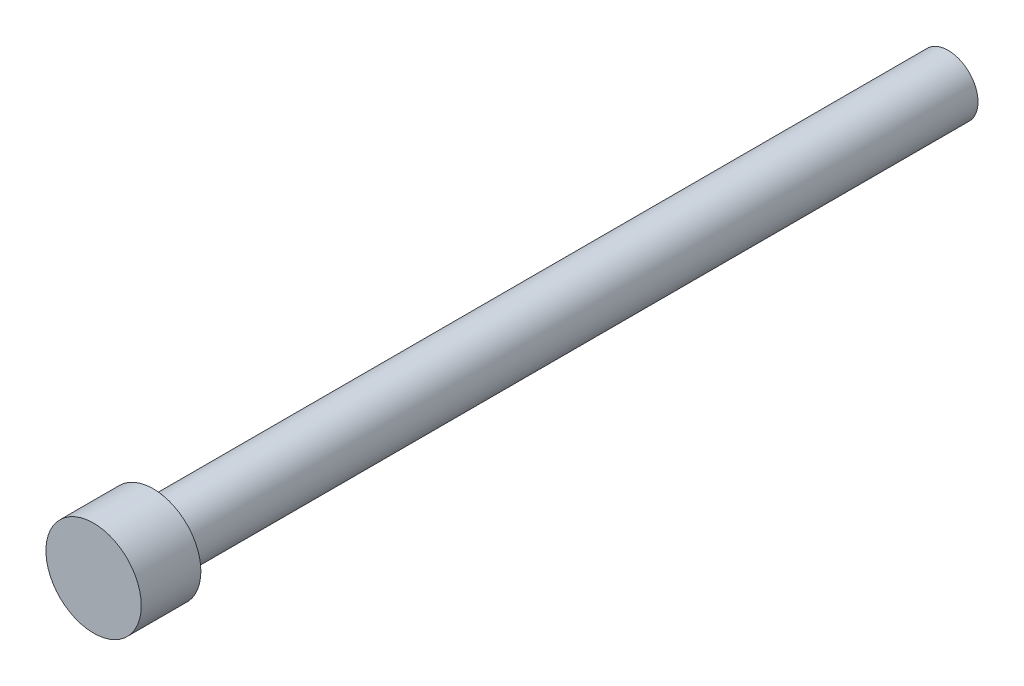
ISO-10303-21;
HEADER;
FILE_DESCRIPTION(('STEP AP214'),'2;1');
FILE_NAME('part.step','',(''),(''),'','','');
FILE_SCHEMA(('AUTOMOTIVE_DESIGN { 1 0 10303 214 1 1 1 1 }'));
ENDSEC;
DATA;
#1=APPLICATION_CONTEXT('core data for automotive mechanical design processes');
#2=APPLICATION_PROTOCOL_DEFINITION('international standard','automotive_design',2000,#1);
#3=PRODUCT_CONTEXT('',#1,'mechanical');
#4=PRODUCT('Part','Part','',(#3));
#5=PRODUCT_RELATED_PRODUCT_CATEGORY('part','',(#4));
#6=PRODUCT_DEFINITION_FORMATION('','',#4);
#7=PRODUCT_DEFINITION_CONTEXT('part definition',#1,'design');
#8=PRODUCT_DEFINITION('design','',#6,#7);
#9=PRODUCT_DEFINITION_SHAPE('','',#8);
#10=(LENGTH_UNIT() NAMED_UNIT(*) SI_UNIT(.MILLI.,.METRE.));
#11=(NAMED_UNIT(*) PLANE_ANGLE_UNIT() SI_UNIT($,.RADIAN.));
#12=(NAMED_UNIT(*) SI_UNIT($,.STERADIAN.) SOLID_ANGLE_UNIT());
#13=UNCERTAINTY_MEASURE_WITH_UNIT(LENGTH_MEASURE(1.E-05),#10,'distance_accuracy_value','');
#14=(GEOMETRIC_REPRESENTATION_CONTEXT(3) GLOBAL_UNCERTAINTY_ASSIGNED_CONTEXT((#13)) GLOBAL_UNIT_ASSIGNED_CONTEXT((#10,
#11,#12)) REPRESENTATION_CONTEXT('',''));
#15=CARTESIAN_POINT('',(0.,0.,0.));
#16=DIRECTION('',(0.,0.,1.));
#17=DIRECTION('',(1.,0.,0.));
#18=AXIS2_PLACEMENT_3D('',#15,#16,#17);
#19=CARTESIAN_POINT('',(0.,0.,-84.709));
#20=DIRECTION('',(0.,0.,-1.));
#21=DIRECTION('',(-1.,0.,0.));
#22=AXIS2_PLACEMENT_3D('',#19,#20,#21);
#23=PLANE('',#22);
#24=CARTESIAN_POINT('',(-81.4431104831983,-68.4681130519978,-84.709));
#25=DIRECTION('',(0.,0.,-1.));
#26=DIRECTION('',(-1.,0.,0.));
#27=AXIS2_PLACEMENT_3D('',#24,#25,#26);
#28=CIRCLE('',#27,3.17500000000001);
#29=CARTESIAN_POINT('',(-84.6181104831983,-68.4681130519978,-84.709));
#30=VERTEX_POINT('',#29);
#31=EDGE_CURVE('E10',#30,#30,#28,.F.);
#32=ORIENTED_EDGE('',*,*,#31,.F.);
#33=EDGE_LOOP('',(#32));
#34=FACE_BOUND('',#33,.T.);
#35=ADVANCED_FACE('F29',(#34),#23,.T.);
#36=CARTESIAN_POINT('',(-81.4431104831983,-68.4681130519978,-96.8642561210691));
#37=DIRECTION('',(0.,0.,1.));
#38=DIRECTION('',(1.,0.,0.));
#39=AXIS2_PLACEMENT_3D('',#36,#37,#38);
#40=CYLINDRICAL_SURFACE('',#39,3.17500000000001);
#41=CARTESIAN_POINT('',(-81.4431104831983,-68.4681130519978,0.));
#42=DIRECTION('',(0.,0.,1.));
#43=DIRECTION('',(1.,0.,0.));
#44=AXIS2_PLACEMENT_3D('',#41,#42,#43);
#45=CIRCLE('',#44,3.17500000000001);
#46=CARTESIAN_POINT('',(-78.2681104831982,-68.4681130519978,0.));
#47=VERTEX_POINT('',#46);
#48=EDGE_CURVE('E35',#47,#47,#45,.T.);
#49=ORIENTED_EDGE('',*,*,#48,.F.);
#50=EDGE_LOOP('',(#49));
#51=FACE_BOUND('',#50,.T.);
#52=ORIENTED_EDGE('',*,*,#31,.T.);
#53=EDGE_LOOP('',(#52));
#54=FACE_BOUND('',#53,.T.);
#55=ADVANCED_FACE('F62',(#51,#54),#40,.T.);
#56=CARTESIAN_POINT('',(-81.4431104831983,-68.4681130519978,6.35));
#57=DIRECTION('',(0.,0.,-1.));
#58=DIRECTION('',(-1.,0.,0.));
#59=AXIS2_PLACEMENT_3D('',#56,#57,#58);
#60=CYLINDRICAL_SURFACE('',#59,5.08000000000001);
#61=CARTESIAN_POINT('',(-81.4431104831983,-68.4681130519978,6.35));
#62=DIRECTION('',(0.,0.,1.));
#63=DIRECTION('',(1.,0.,0.));
#64=AXIS2_PLACEMENT_3D('',#61,#62,#63);
#65=CIRCLE('',#64,5.08000000000001);
#66=CARTESIAN_POINT('',(-76.3631104831983,-68.4681130519978,6.35));
#67=VERTEX_POINT('',#66);
#68=EDGE_CURVE('E39',#67,#67,#65,.T.);
#69=ORIENTED_EDGE('',*,*,#68,.F.);
#70=EDGE_LOOP('',(#69));
#71=FACE_BOUND('',#70,.T.);
#72=CARTESIAN_POINT('',(-81.4431104831983,-68.4681130519978,0.));
#73=DIRECTION('',(0.,0.,1.));
#74=DIRECTION('',(1.,0.,0.));
#75=AXIS2_PLACEMENT_3D('',#72,#73,#74);
#76=CIRCLE('',#75,5.08000000000001);
#77=CARTESIAN_POINT('',(-76.3631104831983,-68.4681130519978,0.));
#78=VERTEX_POINT('',#77);
#79=EDGE_CURVE('E43',#78,#78,#76,.T.);
#80=ORIENTED_EDGE('',*,*,#79,.T.);
#81=EDGE_LOOP('',(#80));
#82=FACE_BOUND('',#81,.T.);
#83=ADVANCED_FACE('F49',(#71,#82),#60,.T.);
#84=CARTESIAN_POINT('',(-81.4431104831983,-68.4681130519978,6.35));
#85=DIRECTION('',(0.,0.,1.));
#86=DIRECTION('',(1.,0.,0.));
#87=AXIS2_PLACEMENT_3D('',#84,#85,#86);
#88=PLANE('',#87);
#89=ORIENTED_EDGE('',*,*,#68,.T.);
#90=EDGE_LOOP('',(#89));
#91=FACE_BOUND('',#90,.T.);
#92=ADVANCED_FACE('F53',(#91),#88,.T.);
#93=CARTESIAN_POINT('',(-81.4431104831983,-68.4681130519978,0.));
#94=DIRECTION('',(0.,0.,1.));
#95=DIRECTION('',(1.,0.,0.));
#96=AXIS2_PLACEMENT_3D('',#93,#94,#95);
#97=PLANE('',#96);
#98=ORIENTED_EDGE('',*,*,#48,.T.);
#99=EDGE_LOOP('',(#98));
#100=FACE_BOUND('',#99,.T.);
#101=ORIENTED_EDGE('',*,*,#79,.F.);
#102=EDGE_LOOP('',(#101));
#103=FACE_BOUND('',#102,.T.);
#104=ADVANCED_FACE('F51',(#100,#103),#97,.F.);
#105=CLOSED_SHELL('',(#35,#55,#83,#92,#104));
#106=MANIFOLD_SOLID_BREP('B2',#105);
#107=ADVANCED_BREP_SHAPE_REPRESENTATION('',(#18,#106),#14);
#108=SHAPE_DEFINITION_REPRESENTATION(#9,#107);
ENDSEC;
END-ISO-10303-21;
